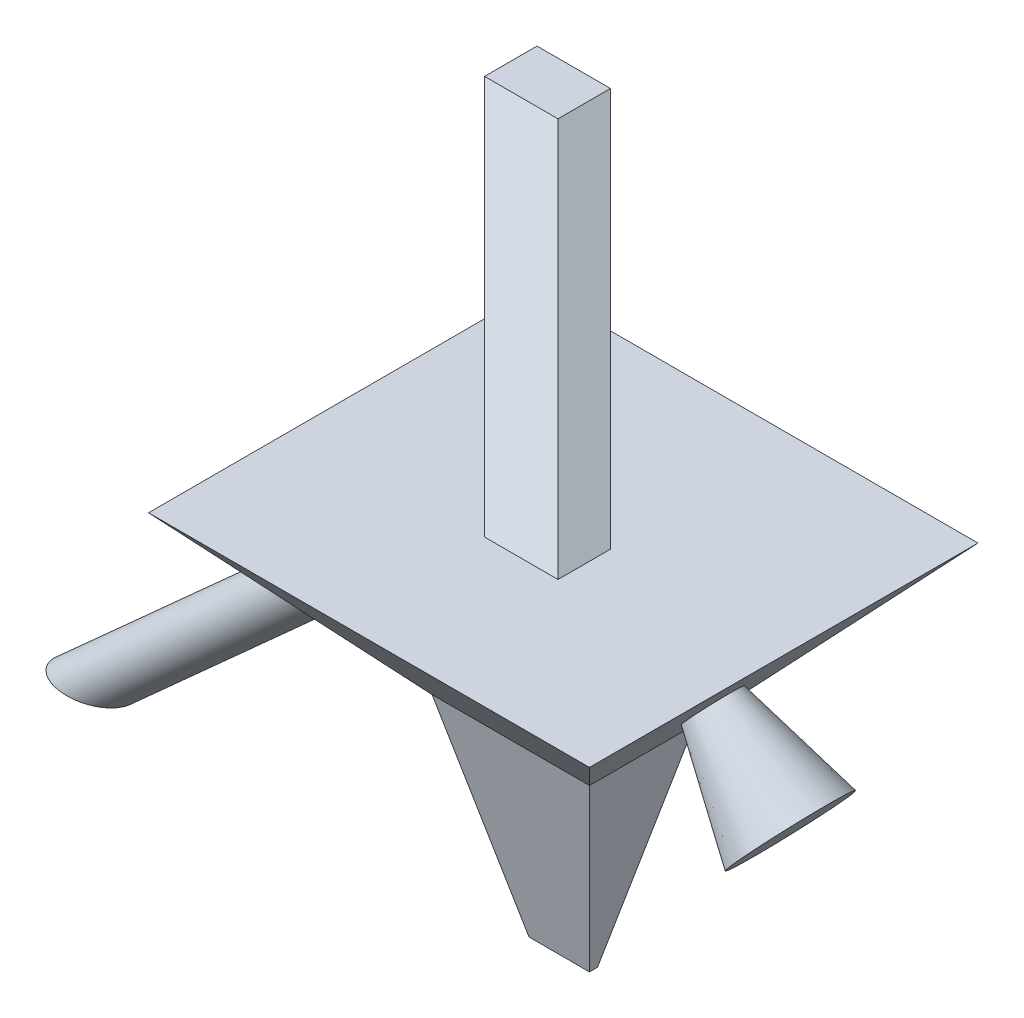
ISO-10303-21;
HEADER;
FILE_DESCRIPTION(('STEP AP214'),'2;1');
FILE_NAME('part.step','',(''),(''),'','','');
FILE_SCHEMA(('AUTOMOTIVE_DESIGN { 1 0 10303 214 1 1 1 1 }'));
ENDSEC;
DATA;
#1=APPLICATION_CONTEXT('core data for automotive mechanical design processes');
#2=APPLICATION_PROTOCOL_DEFINITION('international standard','automotive_design',2000,#1);
#3=PRODUCT_CONTEXT('',#1,'mechanical');
#4=PRODUCT('Part','Part','',(#3));
#5=PRODUCT_RELATED_PRODUCT_CATEGORY('part','',(#4));
#6=PRODUCT_DEFINITION_FORMATION('','',#4);
#7=PRODUCT_DEFINITION_CONTEXT('part definition',#1,'design');
#8=PRODUCT_DEFINITION('design','',#6,#7);
#9=PRODUCT_DEFINITION_SHAPE('','',#8);
#10=(LENGTH_UNIT() NAMED_UNIT(*) SI_UNIT(.MILLI.,.METRE.));
#11=(NAMED_UNIT(*) PLANE_ANGLE_UNIT() SI_UNIT($,.RADIAN.));
#12=(NAMED_UNIT(*) SI_UNIT($,.STERADIAN.) SOLID_ANGLE_UNIT());
#13=UNCERTAINTY_MEASURE_WITH_UNIT(LENGTH_MEASURE(1.E-05),#10,'distance_accuracy_value','');
#14=(GEOMETRIC_REPRESENTATION_CONTEXT(3) GLOBAL_UNCERTAINTY_ASSIGNED_CONTEXT((#13)) GLOBAL_UNIT_ASSIGNED_CONTEXT((#10,
#11,#12)) REPRESENTATION_CONTEXT('',''));
#15=CARTESIAN_POINT('',(0.,0.,0.));
#16=DIRECTION('',(0.,0.,1.));
#17=DIRECTION('',(1.,0.,0.));
#18=AXIS2_PLACEMENT_3D('',#15,#16,#17);
#19=CARTESIAN_POINT('',(375.,0.,250.));
#20=DIRECTION('',(0.974370064785235,-0.224951054343865,0.));
#21=DIRECTION('',(0.224951054343865,0.974370064785235,0.));
#22=AXIS2_PLACEMENT_3D('',#19,#20,#21);
#23=PLANE('',#22);
#24=DIRECTION('',(0.,0.,-1.));
#25=VECTOR('',#24,1.);
#26=CARTESIAN_POINT('',(375.,0.,250.));
#27=LINE('',#26,#25);
#28=CARTESIAN_POINT('',(375.,0.,250.));
#29=VERTEX_POINT('',#28);
#30=CARTESIAN_POINT('',(375.,0.,-250.));
#31=VERTEX_POINT('',#30);
#32=EDGE_CURVE('E180',#29,#31,#27,.T.);
#33=ORIENTED_EDGE('',*,*,#32,.F.);
#34=DIRECTION('',(0.219466743499904,0.950614904677543,0.219466743499904));
#35=VECTOR('',#34,1.);
#36=CARTESIAN_POINT('',(338.87576137316,-156.471268089039,213.87576137316));
#37=LINE('',#36,#35);
#38=CARTESIAN_POINT('',(144.131808874436,-1000.,19.1318088744364));
#39=VERTEX_POINT('',#38);
#40=EDGE_CURVE('E64',#39,#29,#37,.T.);
#41=ORIENTED_EDGE('',*,*,#40,.F.);
#42=DIRECTION('',(0.,0.,-1.));
#43=VECTOR('',#42,1.);
#44=CARTESIAN_POINT('',(144.131808874436,-1000.,250.));
#45=LINE('',#44,#43);
#46=CARTESIAN_POINT('',(144.131808874436,-1000.,-19.1318088744364));
#47=VERTEX_POINT('',#46);
#48=EDGE_CURVE('E220',#39,#47,#45,.T.);
#49=ORIENTED_EDGE('',*,*,#48,.T.);
#50=DIRECTION('',(0.219466743499904,0.950614904677543,-0.219466743499904));
#51=VECTOR('',#50,1.);
#52=CARTESIAN_POINT('',(350.917174248774,-104.314178726026,-225.917174248774));
#53=LINE('',#52,#51);
#54=EDGE_CURVE('E80',#47,#31,#53,.T.);
#55=ORIENTED_EDGE('',*,*,#54,.T.);
#56=EDGE_LOOP('',(#33,#41,#49,#55));
#57=FACE_BOUND('',#56,.T.);
#58=ADVANCED_FACE('F39',(#57),#23,.T.);
#59=CARTESIAN_POINT('',(-375.,0.,250.));
#60=DIRECTION('',(0.,-0.224951054343865,0.974370064785235));
#61=DIRECTION('',(0.,-0.974370064785235,-0.224951054343865));
#62=AXIS2_PLACEMENT_3D('',#59,#60,#61);
#63=PLANE('',#62);
#64=DIRECTION('',(1.,0.,0.));
#65=VECTOR('',#64,1.);
#66=CARTESIAN_POINT('',(-375.,0.,250.));
#67=LINE('',#66,#65);
#68=CARTESIAN_POINT('',(-375.,0.,250.));
#69=VERTEX_POINT('',#68);
#70=EDGE_CURVE('E216',#69,#29,#67,.T.);
#71=ORIENTED_EDGE('',*,*,#70,.F.);
#72=DIRECTION('',(-0.219466743499904,0.950614904677543,0.219466743499904));
#73=VECTOR('',#72,1.);
#74=CARTESIAN_POINT('',(-375.,0.,250.));
#75=LINE('',#74,#73);
#76=CARTESIAN_POINT('',(-144.131808874436,-1000.,19.1318088744364));
#77=VERTEX_POINT('',#76);
#78=EDGE_CURVE('E87',#77,#69,#75,.T.);
#79=ORIENTED_EDGE('',*,*,#78,.F.);
#80=DIRECTION('',(1.,0.,0.));
#81=VECTOR('',#80,1.);
#82=CARTESIAN_POINT('',(-375.,-1000.,19.1318088744364));
#83=LINE('',#82,#81);
#84=EDGE_CURVE('E225',#77,#39,#83,.T.);
#85=ORIENTED_EDGE('',*,*,#84,.T.);
#86=ORIENTED_EDGE('',*,*,#40,.T.);
#87=EDGE_LOOP('',(#71,#79,#85,#86));
#88=FACE_BOUND('',#87,.T.);
#89=ADVANCED_FACE('F41',(#88),#63,.T.);
#90=CARTESIAN_POINT('',(-375.,0.,250.));
#91=DIRECTION('',(-0.974370064785235,-0.224951054343865,0.));
#92=DIRECTION('',(0.224951054343865,-0.974370064785235,0.));
#93=AXIS2_PLACEMENT_3D('',#90,#91,#92);
#94=PLANE('',#93);
#95=DIRECTION('',(0.,0.,1.));
#96=VECTOR('',#95,1.);
#97=CARTESIAN_POINT('',(-375.,0.,250.));
#98=LINE('',#97,#96);
#99=CARTESIAN_POINT('',(-375.,0.,-250.));
#100=VERTEX_POINT('',#99);
#101=EDGE_CURVE('E212',#100,#69,#98,.T.);
#102=ORIENTED_EDGE('',*,*,#101,.F.);
#103=DIRECTION('',(-0.219466743499904,0.950614904677543,-0.219466743499904));
#104=VECTOR('',#103,1.);
#105=CARTESIAN_POINT('',(-375.,0.,-250.));
#106=LINE('',#105,#104);
#107=CARTESIAN_POINT('',(-144.131808874436,-1000.,-19.1318088744364));
#108=VERTEX_POINT('',#107);
#109=EDGE_CURVE('E91',#108,#100,#106,.T.);
#110=ORIENTED_EDGE('',*,*,#109,.F.);
#111=DIRECTION('',(0.,0.,1.));
#112=VECTOR('',#111,1.);
#113=CARTESIAN_POINT('',(-144.131808874436,-1000.,250.));
#114=LINE('',#113,#112);
#115=EDGE_CURVE('E236',#108,#77,#114,.T.);
#116=ORIENTED_EDGE('',*,*,#115,.T.);
#117=ORIENTED_EDGE('',*,*,#78,.T.);
#118=EDGE_LOOP('',(#102,#110,#116,#117));
#119=FACE_BOUND('',#118,.T.);
#120=ADVANCED_FACE('F265',(#119),#94,.T.);
#121=CARTESIAN_POINT('',(-375.,0.,-250.));
#122=DIRECTION('',(0.,-0.224951054343865,-0.974370064785235));
#123=DIRECTION('',(0.,0.974370064785235,-0.224951054343865));
#124=AXIS2_PLACEMENT_3D('',#121,#122,#123);
#125=PLANE('',#124);
#126=DIRECTION('',(-1.,0.,0.));
#127=VECTOR('',#126,1.);
#128=CARTESIAN_POINT('',(-375.,0.,-250.));
#129=LINE('',#128,#127);
#130=EDGE_CURVE('E208',#31,#100,#129,.T.);
#131=ORIENTED_EDGE('',*,*,#130,.F.);
#132=ORIENTED_EDGE('',*,*,#54,.F.);
#133=DIRECTION('',(-1.,0.,0.));
#134=VECTOR('',#133,1.);
#135=CARTESIAN_POINT('',(-375.,-1000.,-19.1318088744364));
#136=LINE('',#135,#134);
#137=EDGE_CURVE('E232',#47,#108,#136,.T.);
#138=ORIENTED_EDGE('',*,*,#137,.T.);
#139=ORIENTED_EDGE('',*,*,#109,.T.);
#140=EDGE_LOOP('',(#131,#132,#138,#139));
#141=FACE_BOUND('',#140,.T.);
#142=ADVANCED_FACE('F268',(#141),#125,.T.);
#143=CARTESIAN_POINT('',(0.,-1000.,0.));
#144=DIRECTION('',(0.,-1.,0.));
#145=DIRECTION('',(0.,0.,-1.));
#146=AXIS2_PLACEMENT_3D('',#143,#144,#145);
#147=PLANE('',#146);
#148=ORIENTED_EDGE('',*,*,#48,.F.);
#149=ORIENTED_EDGE('',*,*,#84,.F.);
#150=ORIENTED_EDGE('',*,*,#115,.F.);
#151=ORIENTED_EDGE('',*,*,#137,.F.);
#152=EDGE_LOOP('',(#148,#149,#150,#151));
#153=FACE_BOUND('',#152,.T.);
#154=ADVANCED_FACE('F250',(#153),#147,.T.);
#155=CARTESIAN_POINT('',(375.,0.,250.));
#156=DIRECTION('',(0.743144825477393,-0.669130606358859,0.));
#157=DIRECTION('',(0.669130606358859,0.743144825477393,0.));
#158=AXIS2_PLACEMENT_3D('',#155,#156,#157);
#159=PLANE('',#158);
#160=CARTESIAN_POINT('',(712.392077012158,374.711863133917,0.));
#161=DIRECTION('',(0.743144825477393,-0.669130606358859,0.));
#162=DIRECTION('',(0.669130606358859,0.743144825477393,0.));
#163=AXIS2_PLACEMENT_3D('',#160,#161,#162);
#164=CIRCLE('',#163,125.);
#165=CARTESIAN_POINT('',(796.033402807016,467.604966318591,0.));
#166=VERTEX_POINT('',#165);
#167=EDGE_CURVE('E48',#166,#166,#164,.T.);
#168=ORIENTED_EDGE('',*,*,#167,.F.);
#169=EDGE_LOOP('',(#168));
#170=FACE_BOUND('',#169,.T.);
#171=ORIENTED_EDGE('',*,*,#32,.T.);
#172=DIRECTION('',(-0.556117091816005,-0.617630601881269,0.556117091816005));
#173=VECTOR('',#172,1.);
#174=CARTESIAN_POINT('',(143.050335142582,-257.606200601085,-18.0503351425818));
#175=LINE('',#174,#173);
#176=CARTESIAN_POINT('',(1050.30303322338,750.,-925.303033223382));
#177=VERTEX_POINT('',#176);
#178=EDGE_CURVE('E176',#177,#31,#175,.T.);
#179=ORIENTED_EDGE('',*,*,#178,.F.);
#180=DIRECTION('',(0.,0.,1.));
#181=VECTOR('',#180,1.);
#182=CARTESIAN_POINT('',(1050.30303322338,750.,0.));
#183=LINE('',#182,#181);
#184=CARTESIAN_POINT('',(1050.30303322338,750.,925.303033223382));
#185=VERTEX_POINT('',#184);
#186=EDGE_CURVE('E175',#185,#177,#183,.F.);
#187=ORIENTED_EDGE('',*,*,#186,.F.);
#188=DIRECTION('',(-0.556117091816005,-0.617630601881269,-0.556117091816005));
#189=VECTOR('',#188,1.);
#190=CARTESIAN_POINT('',(375.,0.,250.));
#191=LINE('',#190,#189);
#192=EDGE_CURVE('E182',#185,#29,#191,.T.);
#193=ORIENTED_EDGE('',*,*,#192,.T.);
#194=EDGE_LOOP('',(#171,#179,#187,#193));
#195=FACE_BOUND('',#194,.T.);
#196=ADVANCED_FACE('F246',(#170,#195),#159,.T.);
#197=CARTESIAN_POINT('',(-375.,0.,-250.));
#198=DIRECTION('',(0.,-0.669130606358859,-0.743144825477393));
#199=DIRECTION('',(0.,0.743144825477393,-0.669130606358859));
#200=AXIS2_PLACEMENT_3D('',#197,#198,#199);
#201=PLANE('',#200);
#202=ORIENTED_EDGE('',*,*,#130,.T.);
#203=DIRECTION('',(0.556117091816005,-0.617630601881269,0.556117091816005));
#204=VECTOR('',#203,1.);
#205=CARTESIAN_POINT('',(-220.366890095055,-171.73746706739,-95.3668900950546));
#206=LINE('',#205,#204);
#207=CARTESIAN_POINT('',(-1050.30303322338,750.,-925.303033223382));
#208=VERTEX_POINT('',#207);
#209=EDGE_CURVE('E181',#208,#100,#206,.T.);
#210=ORIENTED_EDGE('',*,*,#209,.F.);
#211=DIRECTION('',(1.,0.,0.));
#212=VECTOR('',#211,1.);
#213=CARTESIAN_POINT('',(0.,750.,-925.303033223382));
#214=LINE('',#213,#212);
#215=EDGE_CURVE('E197',#177,#208,#214,.F.);
#216=ORIENTED_EDGE('',*,*,#215,.F.);
#217=ORIENTED_EDGE('',*,*,#178,.T.);
#218=EDGE_LOOP('',(#202,#210,#216,#217));
#219=FACE_BOUND('',#218,.T.);
#220=ADVANCED_FACE('F249',(#219),#201,.T.);
#221=CARTESIAN_POINT('',(-375.,0.,250.));
#222=DIRECTION('',(-0.743144825477393,-0.669130606358859,0.));
#223=DIRECTION('',(0.669130606358859,-0.743144825477393,0.));
#224=AXIS2_PLACEMENT_3D('',#221,#222,#223);
#225=PLANE('',#224);
#226=CARTESIAN_POINT('',(-712.392077012158,374.711863133917,0.));
#227=DIRECTION('',(-0.743144825477393,-0.669130606358859,0.));
#228=DIRECTION('',(0.669130606358859,-0.743144825477393,0.));
#229=AXIS2_PLACEMENT_3D('',#226,#227,#228);
#230=CIRCLE('',#229,125.);
#231=CARTESIAN_POINT('',(-628.750751217301,281.818759949243,0.));
#232=VERTEX_POINT('',#231);
#233=EDGE_CURVE('E11',#232,#232,#230,.T.);
#234=ORIENTED_EDGE('',*,*,#233,.F.);
#235=EDGE_LOOP('',(#234));
#236=FACE_BOUND('',#235,.T.);
#237=ORIENTED_EDGE('',*,*,#101,.T.);
#238=DIRECTION('',(0.556117091816005,-0.617630601881269,-0.556117091816005));
#239=VECTOR('',#238,1.);
#240=CARTESIAN_POINT('',(-375.,0.,250.));
#241=LINE('',#240,#239);
#242=CARTESIAN_POINT('',(-1050.30303322338,750.,925.303033223382));
#243=VERTEX_POINT('',#242);
#244=EDGE_CURVE('E186',#243,#69,#241,.T.);
#245=ORIENTED_EDGE('',*,*,#244,.F.);
#246=DIRECTION('',(0.,0.,-1.));
#247=VECTOR('',#246,1.);
#248=CARTESIAN_POINT('',(-1050.30303322338,750.,0.));
#249=LINE('',#248,#247);
#250=EDGE_CURVE('E200',#208,#243,#249,.F.);
#251=ORIENTED_EDGE('',*,*,#250,.F.);
#252=ORIENTED_EDGE('',*,*,#209,.T.);
#253=EDGE_LOOP('',(#237,#245,#251,#252));
#254=FACE_BOUND('',#253,.T.);
#255=ADVANCED_FACE('F263',(#236,#254),#225,.T.);
#256=CARTESIAN_POINT('',(-375.,0.,250.));
#257=DIRECTION('',(0.,-0.669130606358859,0.743144825477393));
#258=DIRECTION('',(0.,-0.743144825477393,-0.669130606358859));
#259=AXIS2_PLACEMENT_3D('',#256,#257,#258);
#260=PLANE('',#259);
#261=ORIENTED_EDGE('',*,*,#70,.T.);
#262=ORIENTED_EDGE('',*,*,#192,.F.);
#263=DIRECTION('',(-1.,0.,0.));
#264=VECTOR('',#263,1.);
#265=CARTESIAN_POINT('',(0.,750.,925.303033223382));
#266=LINE('',#265,#264);
#267=EDGE_CURVE('E187',#243,#185,#266,.F.);
#268=ORIENTED_EDGE('',*,*,#267,.F.);
#269=ORIENTED_EDGE('',*,*,#244,.T.);
#270=EDGE_LOOP('',(#261,#262,#268,#269));
#271=FACE_BOUND('',#270,.T.);
#272=ADVANCED_FACE('F258',(#271),#260,.T.);
#273=CARTESIAN_POINT('',(0.,750.,0.));
#274=DIRECTION('',(0.,-1.,0.));
#275=DIRECTION('',(0.,0.,-1.));
#276=AXIS2_PLACEMENT_3D('',#273,#274,#275);
#277=PLANE('',#276);
#278=DIRECTION('',(0.,0.,-1.));
#279=VECTOR('',#278,1.);
#280=CARTESIAN_POINT('',(200.101011074461,750.,538.337725353805));
#281=LINE('',#280,#279);
#282=CARTESIAN_POINT('',(200.101011074461,750.,225.101011074461));
#283=VERTEX_POINT('',#282);
#284=CARTESIAN_POINT('',(200.101011074461,750.,-24.8989889255391));
#285=VERTEX_POINT('',#284);
#286=EDGE_CURVE('E133',#283,#285,#281,.T.);
#287=ORIENTED_EDGE('',*,*,#286,.F.);
#288=DIRECTION('',(1.,0.,0.));
#289=VECTOR('',#288,1.);
#290=CARTESIAN_POINT('',(513.337725353805,750.,225.101011074461));
#291=LINE('',#290,#289);
#292=CARTESIAN_POINT('',(-149.898988925539,750.,225.101011074461));
#293=VERTEX_POINT('',#292);
#294=EDGE_CURVE('E140',#293,#283,#291,.T.);
#295=ORIENTED_EDGE('',*,*,#294,.F.);
#296=DIRECTION('',(0.,0.,1.));
#297=VECTOR('',#296,1.);
#298=CARTESIAN_POINT('',(-149.898988925539,750.,538.337725353805));
#299=LINE('',#298,#297);
#300=CARTESIAN_POINT('',(-149.898988925539,750.,-24.8989889255392));
#301=VERTEX_POINT('',#300);
#302=EDGE_CURVE('E163',#301,#293,#299,.T.);
#303=ORIENTED_EDGE('',*,*,#302,.F.);
#304=DIRECTION('',(-1.,0.,0.));
#305=VECTOR('',#304,1.);
#306=CARTESIAN_POINT('',(513.337725353805,750.,-24.8989889255392));
#307=LINE('',#306,#305);
#308=EDGE_CURVE('E55',#285,#301,#307,.T.);
#309=ORIENTED_EDGE('',*,*,#308,.F.);
#310=EDGE_LOOP('',(#287,#295,#303,#309));
#311=FACE_BOUND('',#310,.T.);
#312=ORIENTED_EDGE('',*,*,#186,.T.);
#313=ORIENTED_EDGE('',*,*,#215,.T.);
#314=ORIENTED_EDGE('',*,*,#250,.T.);
#315=ORIENTED_EDGE('',*,*,#267,.T.);
#316=EDGE_LOOP('',(#312,#313,#314,#315));
#317=FACE_BOUND('',#316,.T.);
#318=ADVANCED_FACE('F151',(#311,#317),#277,.F.);
#319=CARTESIAN_POINT('',(712.392077012158,374.711863133917,0.));
#320=DIRECTION('',(0.743144825477393,-0.669130606358859,0.));
#321=DIRECTION('',(0.669130606358859,0.743144825477393,0.));
#322=AXIS2_PLACEMENT_3D('',#319,#320,#321);
#323=CONICAL_SURFACE('',#322,125.,0.26179938779915);
#324=CARTESIAN_POINT('',(1082.15278051564,41.7778302769619,0.));
#325=DIRECTION('',(0.743144825477393,-0.669130606358859,0.));
#326=DIRECTION('',(0.669130606358859,0.743144825477393,0.));
#327=AXIS2_PLACEMENT_3D('',#324,#325,#326);
#328=CIRCLE('',#327,258.321364153853);
#329=CARTESIAN_POINT('',(1255.00351154736,233.748015358159,0.));
#330=VERTEX_POINT('',#329);
#331=EDGE_CURVE('E171',#330,#330,#328,.T.);
#332=ORIENTED_EDGE('',*,*,#331,.F.);
#333=EDGE_LOOP('',(#332));
#334=FACE_BOUND('',#333,.T.);
#335=ORIENTED_EDGE('',*,*,#167,.T.);
#336=EDGE_LOOP('',(#335));
#337=FACE_BOUND('',#336,.T.);
#338=ADVANCED_FACE('F244',(#334,#337),#323,.T.);
#339=CARTESIAN_POINT('',(1082.15278051564,41.777830276962,0.));
#340=DIRECTION('',(0.743144825477393,-0.669130606358859,0.));
#341=DIRECTION('',(0.669130606358859,0.743144825477393,0.));
#342=AXIS2_PLACEMENT_3D('',#339,#340,#341);
#343=PLANE('',#342);
#344=ORIENTED_EDGE('',*,*,#331,.T.);
#345=EDGE_LOOP('',(#344));
#346=FACE_BOUND('',#345,.T.);
#347=ADVANCED_FACE('F294',(#346),#343,.T.);
#348=CARTESIAN_POINT('',(-2566.86537299412,-1295.06339261059,0.));
#349=DIRECTION('',(0.743144825477393,0.669130606358859,0.));
#350=DIRECTION('',(-0.669130606358859,0.743144825477393,0.));
#351=AXIS2_PLACEMENT_3D('',#348,#349,#350);
#352=CYLINDRICAL_SURFACE('',#351,125.);
#353=ORIENTED_EDGE('',*,*,#233,.T.);
#354=EDGE_LOOP('',(#353));
#355=FACE_BOUND('',#354,.T.);
#356=CARTESIAN_POINT('',(-2239.16427649284,-1000.,0.));
#357=DIRECTION('',(0.,-1.,0.));
#358=DIRECTION('',(1.,0.,0.));
#359=AXIS2_PLACEMENT_3D('',#356,#357,#358);
#360=ELLIPSE('',#359,186.809568733076,125.);
#361=CARTESIAN_POINT('',(-2052.35470775976,-1000.,0.));
#362=VERTEX_POINT('',#361);
#363=EDGE_CURVE('E167',#362,#362,#360,.T.);
#364=ORIENTED_EDGE('',*,*,#363,.F.);
#365=EDGE_LOOP('',(#364));
#366=FACE_BOUND('',#365,.T.);
#367=ADVANCED_FACE('F298',(#355,#366),#352,.T.);
#368=CARTESIAN_POINT('',(0.,-1000.,0.));
#369=DIRECTION('',(0.,-1.,0.));
#370=DIRECTION('',(0.,0.,-1.));
#371=AXIS2_PLACEMENT_3D('',#368,#369,#370);
#372=PLANE('',#371);
#373=ORIENTED_EDGE('',*,*,#363,.T.);
#374=EDGE_LOOP('',(#373));
#375=FACE_BOUND('',#374,.T.);
#376=ADVANCED_FACE('F300',(#375),#372,.T.);
#377=CARTESIAN_POINT('',(0.,1750.,0.));
#378=DIRECTION('',(0.,1.,0.));
#379=DIRECTION('',(0.,0.,1.));
#380=AXIS2_PLACEMENT_3D('',#377,#378,#379);
#381=PLANE('',#380);
#382=DIRECTION('',(0.,0.,1.));
#383=VECTOR('',#382,1.);
#384=CARTESIAN_POINT('',(-1050.30303322338,1750.,-675.303033223382));
#385=LINE('',#384,#383);
#386=CARTESIAN_POINT('',(-1050.30303322338,1750.,-925.303033223382));
#387=VERTEX_POINT('',#386);
#388=CARTESIAN_POINT('',(-1050.30303322338,1750.,-675.303033223382));
#389=VERTEX_POINT('',#388);
#390=EDGE_CURVE('E326',#387,#389,#385,.T.);
#391=ORIENTED_EDGE('',*,*,#390,.T.);
#392=DIRECTION('',(1.,0.,0.));
#393=VECTOR('',#392,1.);
#394=CARTESIAN_POINT('',(-700.303033223382,1750.,-675.303033223382));
#395=LINE('',#394,#393);
#396=CARTESIAN_POINT('',(-700.303033223382,1750.,-675.303033223382));
#397=VERTEX_POINT('',#396);
#398=EDGE_CURVE('E327',#389,#397,#395,.T.);
#399=ORIENTED_EDGE('',*,*,#398,.T.);
#400=DIRECTION('',(0.,0.,-1.));
#401=VECTOR('',#400,1.);
#402=CARTESIAN_POINT('',(-700.303033223382,1750.,-675.303033223382));
#403=LINE('',#402,#401);
#404=CARTESIAN_POINT('',(-700.303033223382,1750.,-925.303033223382));
#405=VERTEX_POINT('',#404);
#406=EDGE_CURVE('E135',#397,#405,#403,.T.);
#407=ORIENTED_EDGE('',*,*,#406,.T.);
#408=DIRECTION('',(-1.,0.,0.));
#409=VECTOR('',#408,1.);
#410=CARTESIAN_POINT('',(-700.303033223382,1750.,-925.303033223382));
#411=LINE('',#410,#409);
#412=EDGE_CURVE('E149',#405,#387,#411,.T.);
#413=ORIENTED_EDGE('',*,*,#412,.T.);
#414=EDGE_LOOP('',(#391,#399,#407,#413));
#415=FACE_BOUND('',#414,.T.);
#416=ADVANCED_FACE('F303',(#415),#381,.T.);
#417=CARTESIAN_POINT('',(513.337725353805,402.115385017385,538.337725353805));
#418=DIRECTION('',(0.,0.66913060635886,0.743144825477393));
#419=DIRECTION('',(0.,-0.743144825477393,0.66913060635886));
#420=AXIS2_PLACEMENT_3D('',#417,#418,#419);
#421=PLANE('',#420);
#422=DIRECTION('',(-0.556117091816005,0.617630601881269,-0.556117091816005));
#423=VECTOR('',#422,1.);
#424=CARTESIAN_POINT('',(163.337725353805,402.115385017385,538.337725353805));
#425=LINE('',#424,#423);
#426=EDGE_CURVE('E145',#293,#389,#425,.T.);
#427=ORIENTED_EDGE('',*,*,#426,.F.);
#428=ORIENTED_EDGE('',*,*,#294,.T.);
#429=DIRECTION('',(-0.556117091816005,0.617630601881269,-0.556117091816005));
#430=VECTOR('',#429,1.);
#431=CARTESIAN_POINT('',(513.337725353805,402.115385017385,538.337725353805));
#432=LINE('',#431,#430);
#433=EDGE_CURVE('E129',#283,#397,#432,.T.);
#434=ORIENTED_EDGE('',*,*,#433,.T.);
#435=ORIENTED_EDGE('',*,*,#398,.F.);
#436=EDGE_LOOP('',(#427,#428,#434,#435));
#437=FACE_BOUND('',#436,.T.);
#438=ADVANCED_FACE('F144',(#437),#421,.T.);
#439=CARTESIAN_POINT('',(513.337725353805,402.115385017385,538.337725353805));
#440=DIRECTION('',(0.743144825477393,0.669130606358859,0.));
#441=DIRECTION('',(-0.669130606358859,0.743144825477393,0.));
#442=AXIS2_PLACEMENT_3D('',#439,#440,#441);
#443=PLANE('',#442);
#444=ORIENTED_EDGE('',*,*,#433,.F.);
#445=ORIENTED_EDGE('',*,*,#286,.T.);
#446=DIRECTION('',(-0.556117091816005,0.617630601881269,-0.556117091816005));
#447=VECTOR('',#446,1.);
#448=CARTESIAN_POINT('',(513.337725353805,402.115385017385,288.337725353805));
#449=LINE('',#448,#447);
#450=EDGE_CURVE('E154',#285,#405,#449,.T.);
#451=ORIENTED_EDGE('',*,*,#450,.T.);
#452=ORIENTED_EDGE('',*,*,#406,.F.);
#453=EDGE_LOOP('',(#444,#445,#451,#452));
#454=FACE_BOUND('',#453,.T.);
#455=ADVANCED_FACE('F131',(#454),#443,.T.);
#456=CARTESIAN_POINT('',(513.337725353805,402.115385017385,288.337725353805));
#457=DIRECTION('',(0.,-0.669130606358859,-0.743144825477393));
#458=DIRECTION('',(0.,0.743144825477393,-0.669130606358859));
#459=AXIS2_PLACEMENT_3D('',#456,#457,#458);
#460=PLANE('',#459);
#461=ORIENTED_EDGE('',*,*,#450,.F.);
#462=ORIENTED_EDGE('',*,*,#308,.T.);
#463=DIRECTION('',(-0.556117091816005,0.617630601881269,-0.556117091816005));
#464=VECTOR('',#463,1.);
#465=CARTESIAN_POINT('',(163.337725353805,402.115385017385,288.337725353805));
#466=LINE('',#465,#464);
#467=EDGE_CURVE('E161',#301,#387,#466,.T.);
#468=ORIENTED_EDGE('',*,*,#467,.T.);
#469=ORIENTED_EDGE('',*,*,#412,.F.);
#470=EDGE_LOOP('',(#461,#462,#468,#469));
#471=FACE_BOUND('',#470,.T.);
#472=ADVANCED_FACE('F312',(#471),#460,.T.);
#473=CARTESIAN_POINT('',(163.337725353805,402.115385017385,538.337725353805));
#474=DIRECTION('',(-0.743144825477393,-0.669130606358859,0.));
#475=DIRECTION('',(0.669130606358859,-0.743144825477393,0.));
#476=AXIS2_PLACEMENT_3D('',#473,#474,#475);
#477=PLANE('',#476);
#478=ORIENTED_EDGE('',*,*,#467,.F.);
#479=ORIENTED_EDGE('',*,*,#302,.T.);
#480=ORIENTED_EDGE('',*,*,#426,.T.);
#481=ORIENTED_EDGE('',*,*,#390,.F.);
#482=EDGE_LOOP('',(#478,#479,#480,#481));
#483=FACE_BOUND('',#482,.T.);
#484=ADVANCED_FACE('F315',(#483),#477,.T.);
#485=CLOSED_SHELL('',(#58,#89,#120,#142,#154,#196,#220,#255,#272,#318,#338,#347,#367,#376,#416,
#438,#455,#472,#484));
#486=MANIFOLD_SOLID_BREP('B2',#485);
#487=ADVANCED_BREP_SHAPE_REPRESENTATION('',(#18,#486),#14);
#488=SHAPE_DEFINITION_REPRESENTATION(#9,#487);
ENDSEC;
END-ISO-10303-21;
